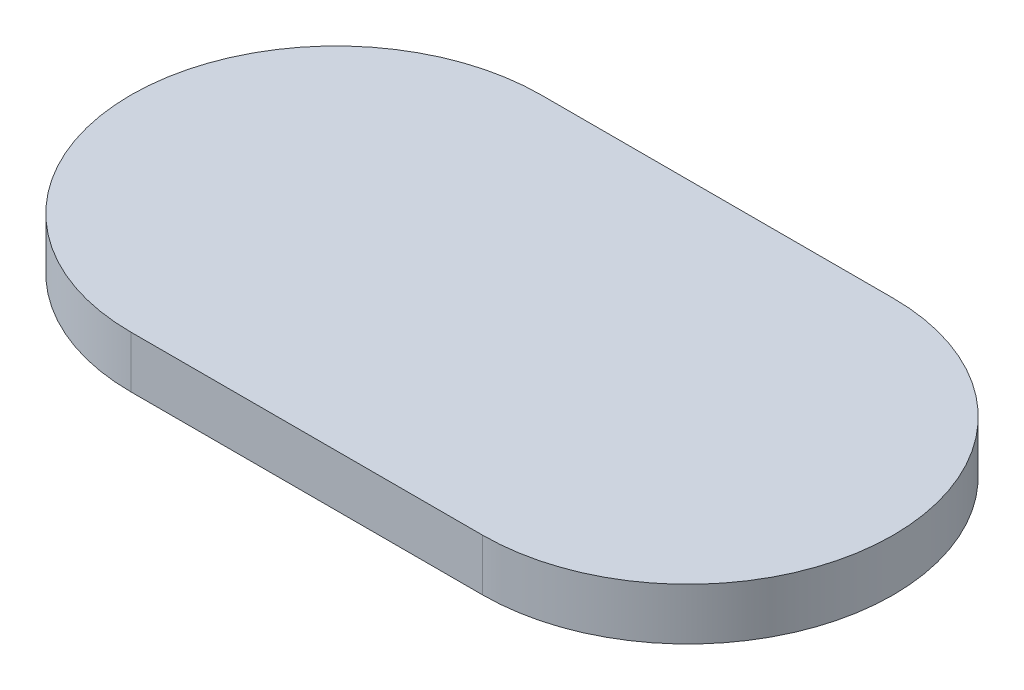
ISO-10303-21;
HEADER;
FILE_DESCRIPTION(('STEP AP214'),'2;1');
FILE_NAME('part.step','',(''),(''),'','','');
FILE_SCHEMA(('AUTOMOTIVE_DESIGN { 1 0 10303 214 1 1 1 1 }'));
ENDSEC;
DATA;
#1=APPLICATION_CONTEXT('core data for automotive mechanical design processes');
#2=APPLICATION_PROTOCOL_DEFINITION('international standard','automotive_design',2000,#1);
#3=PRODUCT_CONTEXT('',#1,'mechanical');
#4=PRODUCT('Part','Part','',(#3));
#5=PRODUCT_RELATED_PRODUCT_CATEGORY('part','',(#4));
#6=PRODUCT_DEFINITION_FORMATION('','',#4);
#7=PRODUCT_DEFINITION_CONTEXT('part definition',#1,'design');
#8=PRODUCT_DEFINITION('design','',#6,#7);
#9=PRODUCT_DEFINITION_SHAPE('','',#8);
#10=(LENGTH_UNIT() NAMED_UNIT(*) SI_UNIT(.MILLI.,.METRE.));
#11=(NAMED_UNIT(*) PLANE_ANGLE_UNIT() SI_UNIT($,.RADIAN.));
#12=(NAMED_UNIT(*) SI_UNIT($,.STERADIAN.) SOLID_ANGLE_UNIT());
#13=UNCERTAINTY_MEASURE_WITH_UNIT(LENGTH_MEASURE(1.E-05),#10,'distance_accuracy_value','');
#14=(GEOMETRIC_REPRESENTATION_CONTEXT(3) GLOBAL_UNCERTAINTY_ASSIGNED_CONTEXT((#13)) GLOBAL_UNIT_ASSIGNED_CONTEXT((#10,
#11,#12)) REPRESENTATION_CONTEXT('',''));
#15=CARTESIAN_POINT('',(0.,0.,0.));
#16=DIRECTION('',(0.,0.,1.));
#17=DIRECTION('',(1.,0.,0.));
#18=AXIS2_PLACEMENT_3D('',#15,#16,#17);
#19=CARTESIAN_POINT('',(10.2,3.,0.));
#20=DIRECTION('',(0.,-1.,0.));
#21=DIRECTION('',(0.,0.,-1.));
#22=AXIS2_PLACEMENT_3D('',#19,#20,#21);
#23=CYLINDRICAL_SURFACE('',#22,11.9);
#24=CARTESIAN_POINT('',(10.2,0.,0.));
#25=DIRECTION('',(0.,1.,0.));
#26=DIRECTION('',(0.,0.,1.));
#27=AXIS2_PLACEMENT_3D('',#24,#25,#26);
#28=CIRCLE('',#27,11.9);
#29=CARTESIAN_POINT('',(10.2,0.,11.9));
#30=VERTEX_POINT('',#29);
#31=CARTESIAN_POINT('',(10.2,0.,-11.9));
#32=VERTEX_POINT('',#31);
#33=EDGE_CURVE('E102',#30,#32,#28,.T.);
#34=ORIENTED_EDGE('',*,*,#33,.T.);
#35=DIRECTION('',(0.,-1.,0.));
#36=VECTOR('',#35,1.);
#37=CARTESIAN_POINT('',(10.2,3.,-11.9));
#38=LINE('',#37,#36);
#39=CARTESIAN_POINT('',(10.2,3.,-11.9));
#40=VERTEX_POINT('',#39);
#41=EDGE_CURVE('E93',#40,#32,#38,.T.);
#42=ORIENTED_EDGE('',*,*,#41,.F.);
#43=CARTESIAN_POINT('',(10.2,3.,0.));
#44=DIRECTION('',(0.,1.,0.));
#45=DIRECTION('',(0.,0.,1.));
#46=AXIS2_PLACEMENT_3D('',#43,#44,#45);
#47=CIRCLE('',#46,11.9);
#48=CARTESIAN_POINT('',(10.2,3.,11.9));
#49=VERTEX_POINT('',#48);
#50=EDGE_CURVE('E87',#49,#40,#47,.T.);
#51=ORIENTED_EDGE('',*,*,#50,.F.);
#52=DIRECTION('',(0.,-1.,0.));
#53=VECTOR('',#52,1.);
#54=CARTESIAN_POINT('',(10.2,3.,11.9));
#55=LINE('',#54,#53);
#56=EDGE_CURVE('E98',#49,#30,#55,.T.);
#57=ORIENTED_EDGE('',*,*,#56,.T.);
#58=EDGE_LOOP('',(#34,#42,#51,#57));
#59=FACE_BOUND('',#58,.T.);
#60=ADVANCED_FACE('F33',(#59),#23,.T.);
#61=CARTESIAN_POINT('',(10.2,3.,-11.9));
#62=DIRECTION('',(0.,0.,1.));
#63=DIRECTION('',(1.,0.,0.));
#64=AXIS2_PLACEMENT_3D('',#61,#62,#63);
#65=PLANE('',#64);
#66=DIRECTION('',(-1.,0.,0.));
#67=VECTOR('',#66,1.);
#68=CARTESIAN_POINT('',(10.2,0.,-11.9));
#69=LINE('',#68,#67);
#70=CARTESIAN_POINT('',(-10.2,0.,-11.9));
#71=VERTEX_POINT('',#70);
#72=EDGE_CURVE('E92',#32,#71,#69,.T.);
#73=ORIENTED_EDGE('',*,*,#72,.T.);
#74=DIRECTION('',(0.,-1.,0.));
#75=VECTOR('',#74,1.);
#76=CARTESIAN_POINT('',(-10.2,3.,-11.9));
#77=LINE('',#76,#75);
#78=CARTESIAN_POINT('',(-10.2,3.,-11.9));
#79=VERTEX_POINT('',#78);
#80=EDGE_CURVE('E90',#79,#71,#77,.T.);
#81=ORIENTED_EDGE('',*,*,#80,.F.);
#82=DIRECTION('',(-1.,0.,0.));
#83=VECTOR('',#82,1.);
#84=CARTESIAN_POINT('',(10.2,3.,-11.9));
#85=LINE('',#84,#83);
#86=EDGE_CURVE('E82',#40,#79,#85,.T.);
#87=ORIENTED_EDGE('',*,*,#86,.F.);
#88=ORIENTED_EDGE('',*,*,#41,.T.);
#89=EDGE_LOOP('',(#73,#81,#87,#88));
#90=FACE_BOUND('',#89,.T.);
#91=ADVANCED_FACE('F91',(#90),#65,.F.);
#92=CARTESIAN_POINT('',(-10.2,3.,0.));
#93=DIRECTION('',(0.,-1.,0.));
#94=DIRECTION('',(0.,0.,-1.));
#95=AXIS2_PLACEMENT_3D('',#92,#93,#94);
#96=CYLINDRICAL_SURFACE('',#95,11.9);
#97=CARTESIAN_POINT('',(-10.2,0.,0.));
#98=DIRECTION('',(0.,1.,0.));
#99=DIRECTION('',(0.,0.,1.));
#100=AXIS2_PLACEMENT_3D('',#97,#98,#99);
#101=CIRCLE('',#100,11.9);
#102=CARTESIAN_POINT('',(-10.2,0.,11.9));
#103=VERTEX_POINT('',#102);
#104=EDGE_CURVE('E68',#71,#103,#101,.T.);
#105=ORIENTED_EDGE('',*,*,#104,.T.);
#106=DIRECTION('',(0.,-1.,0.));
#107=VECTOR('',#106,1.);
#108=CARTESIAN_POINT('',(-10.2,3.,11.9));
#109=LINE('',#108,#107);
#110=CARTESIAN_POINT('',(-10.2,3.,11.9));
#111=VERTEX_POINT('',#110);
#112=EDGE_CURVE('E94',#111,#103,#109,.T.);
#113=ORIENTED_EDGE('',*,*,#112,.F.);
#114=CARTESIAN_POINT('',(-10.2,3.,0.));
#115=DIRECTION('',(0.,1.,0.));
#116=DIRECTION('',(0.,0.,1.));
#117=AXIS2_PLACEMENT_3D('',#114,#115,#116);
#118=CIRCLE('',#117,11.9);
#119=EDGE_CURVE('E85',#79,#111,#118,.T.);
#120=ORIENTED_EDGE('',*,*,#119,.F.);
#121=ORIENTED_EDGE('',*,*,#80,.T.);
#122=EDGE_LOOP('',(#105,#113,#120,#121));
#123=FACE_BOUND('',#122,.T.);
#124=ADVANCED_FACE('F96',(#123),#96,.T.);
#125=CARTESIAN_POINT('',(10.2,3.,11.9));
#126=DIRECTION('',(0.,0.,-1.));
#127=DIRECTION('',(-1.,0.,0.));
#128=AXIS2_PLACEMENT_3D('',#125,#126,#127);
#129=PLANE('',#128);
#130=DIRECTION('',(1.,0.,0.));
#131=VECTOR('',#130,1.);
#132=CARTESIAN_POINT('',(10.2,0.,11.9));
#133=LINE('',#132,#131);
#134=EDGE_CURVE('E74',#103,#30,#133,.T.);
#135=ORIENTED_EDGE('',*,*,#134,.T.);
#136=ORIENTED_EDGE('',*,*,#56,.F.);
#137=DIRECTION('',(1.,0.,0.));
#138=VECTOR('',#137,1.);
#139=CARTESIAN_POINT('',(10.2,3.,11.9));
#140=LINE('',#139,#138);
#141=EDGE_CURVE('E51',#111,#49,#140,.T.);
#142=ORIENTED_EDGE('',*,*,#141,.F.);
#143=ORIENTED_EDGE('',*,*,#112,.T.);
#144=EDGE_LOOP('',(#135,#136,#142,#143));
#145=FACE_BOUND('',#144,.T.);
#146=ADVANCED_FACE('F155',(#145),#129,.F.);
#147=CARTESIAN_POINT('',(10.2,3.,0.));
#148=DIRECTION('',(0.,1.,0.));
#149=DIRECTION('',(0.,0.,1.));
#150=AXIS2_PLACEMENT_3D('',#147,#148,#149);
#151=PLANE('',#150);
#152=ORIENTED_EDGE('',*,*,#50,.T.);
#153=ORIENTED_EDGE('',*,*,#86,.T.);
#154=ORIENTED_EDGE('',*,*,#119,.T.);
#155=ORIENTED_EDGE('',*,*,#141,.T.);
#156=EDGE_LOOP('',(#152,#153,#154,#155));
#157=FACE_BOUND('',#156,.T.);
#158=ADVANCED_FACE('F83',(#157),#151,.T.);
#159=CARTESIAN_POINT('',(10.2,0.,0.));
#160=DIRECTION('',(0.,1.,0.));
#161=DIRECTION('',(0.,0.,1.));
#162=AXIS2_PLACEMENT_3D('',#159,#160,#161);
#163=PLANE('',#162);
#164=CARTESIAN_POINT('',(10.2,0.,0.));
#165=DIRECTION('',(0.,1.,0.));
#166=DIRECTION('',(0.,0.,1.));
#167=AXIS2_PLACEMENT_3D('',#164,#165,#166);
#168=CIRCLE('',#167,1.75);
#169=CARTESIAN_POINT('',(10.2,0.,1.75));
#170=VERTEX_POINT('',#169);
#171=EDGE_CURVE('E36',#170,#170,#168,.F.);
#172=ORIENTED_EDGE('',*,*,#171,.F.);
#173=EDGE_LOOP('',(#172));
#174=FACE_BOUND('',#173,.T.);
#175=CARTESIAN_POINT('',(-10.2,0.,0.));
#176=DIRECTION('',(0.,1.,0.));
#177=DIRECTION('',(0.,0.,1.));
#178=AXIS2_PLACEMENT_3D('',#175,#176,#177);
#179=CIRCLE('',#178,3.25);
#180=CARTESIAN_POINT('',(-10.2,0.,3.25));
#181=VERTEX_POINT('',#180);
#182=EDGE_CURVE('E111',#181,#181,#179,.F.);
#183=ORIENTED_EDGE('',*,*,#182,.F.);
#184=EDGE_LOOP('',(#183));
#185=FACE_BOUND('',#184,.T.);
#186=ORIENTED_EDGE('',*,*,#33,.F.);
#187=ORIENTED_EDGE('',*,*,#134,.F.);
#188=ORIENTED_EDGE('',*,*,#104,.F.);
#189=ORIENTED_EDGE('',*,*,#72,.F.);
#190=EDGE_LOOP('',(#186,#187,#188,#189));
#191=FACE_BOUND('',#190,.T.);
#192=ADVANCED_FACE('F136',(#174,#185,#191),#163,.F.);
#193=CARTESIAN_POINT('',(-10.2,-5.,0.));
#194=DIRECTION('',(0.,1.,0.));
#195=DIRECTION('',(0.,0.,1.));
#196=AXIS2_PLACEMENT_3D('',#193,#194,#195);
#197=CYLINDRICAL_SURFACE('',#196,3.25);
#198=CARTESIAN_POINT('',(-10.2,-5.,0.));
#199=DIRECTION('',(0.,-1.,0.));
#200=DIRECTION('',(0.,0.,-1.));
#201=AXIS2_PLACEMENT_3D('',#198,#199,#200);
#202=CIRCLE('',#201,3.25);
#203=CARTESIAN_POINT('',(-10.2,-5.,-3.25));
#204=VERTEX_POINT('',#203);
#205=EDGE_CURVE('E105',#204,#204,#202,.T.);
#206=ORIENTED_EDGE('',*,*,#205,.F.);
#207=EDGE_LOOP('',(#206));
#208=FACE_BOUND('',#207,.T.);
#209=ORIENTED_EDGE('',*,*,#182,.T.);
#210=EDGE_LOOP('',(#209));
#211=FACE_BOUND('',#210,.T.);
#212=ADVANCED_FACE('F134',(#208,#211),#197,.T.);
#213=CARTESIAN_POINT('',(-10.2,-5.,0.));
#214=DIRECTION('',(0.,-1.,0.));
#215=DIRECTION('',(0.,0.,-1.));
#216=AXIS2_PLACEMENT_3D('',#213,#214,#215);
#217=PLANE('',#216);
#218=CARTESIAN_POINT('',(-10.2,-5.,0.));
#219=DIRECTION('',(0.,-1.,0.));
#220=DIRECTION('',(0.,0.,-1.));
#221=AXIS2_PLACEMENT_3D('',#218,#219,#220);
#222=CIRCLE('',#221,2.5);
#223=CARTESIAN_POINT('',(-10.2,-5.,-2.5));
#224=VERTEX_POINT('',#223);
#225=EDGE_CURVE('E42',#224,#224,#222,.T.);
#226=ORIENTED_EDGE('',*,*,#225,.F.);
#227=EDGE_LOOP('',(#226));
#228=FACE_BOUND('',#227,.T.);
#229=ORIENTED_EDGE('',*,*,#205,.T.);
#230=EDGE_LOOP('',(#229));
#231=FACE_BOUND('',#230,.T.);
#232=ADVANCED_FACE('F132',(#228,#231),#217,.T.);
#233=CARTESIAN_POINT('',(10.2,-5.,0.));
#234=DIRECTION('',(0.,1.,0.));
#235=DIRECTION('',(0.,0.,1.));
#236=AXIS2_PLACEMENT_3D('',#233,#234,#235);
#237=CYLINDRICAL_SURFACE('',#236,1.75);
#238=CARTESIAN_POINT('',(10.2,-5.,0.));
#239=DIRECTION('',(0.,-1.,0.));
#240=DIRECTION('',(0.,0.,-1.));
#241=AXIS2_PLACEMENT_3D('',#238,#239,#240);
#242=CIRCLE('',#241,1.75);
#243=CARTESIAN_POINT('',(10.2,-5.,-1.75));
#244=VERTEX_POINT('',#243);
#245=EDGE_CURVE('E126',#244,#244,#242,.T.);
#246=ORIENTED_EDGE('',*,*,#245,.F.);
#247=EDGE_LOOP('',(#246));
#248=FACE_BOUND('',#247,.T.);
#249=ORIENTED_EDGE('',*,*,#171,.T.);
#250=EDGE_LOOP('',(#249));
#251=FACE_BOUND('',#250,.T.);
#252=ADVANCED_FACE('F142',(#248,#251),#237,.T.);
#253=CARTESIAN_POINT('',(10.2,-5.,0.));
#254=DIRECTION('',(0.,-1.,0.));
#255=DIRECTION('',(0.,0.,-1.));
#256=AXIS2_PLACEMENT_3D('',#253,#254,#255);
#257=PLANE('',#256);
#258=CARTESIAN_POINT('',(10.2,-5.,0.));
#259=DIRECTION('',(0.,-1.,0.));
#260=DIRECTION('',(0.,0.,-1.));
#261=AXIS2_PLACEMENT_3D('',#258,#259,#260);
#262=CIRCLE('',#261,1.);
#263=CARTESIAN_POINT('',(10.2,-5.,-1.));
#264=VERTEX_POINT('',#263);
#265=EDGE_CURVE('E11',#264,#264,#262,.T.);
#266=ORIENTED_EDGE('',*,*,#265,.F.);
#267=EDGE_LOOP('',(#266));
#268=FACE_BOUND('',#267,.T.);
#269=ORIENTED_EDGE('',*,*,#245,.T.);
#270=EDGE_LOOP('',(#269));
#271=FACE_BOUND('',#270,.T.);
#272=ADVANCED_FACE('F209',(#268,#271),#257,.T.);
#273=CARTESIAN_POINT('',(-10.2,-7.5,0.));
#274=DIRECTION('',(0.,1.,0.));
#275=DIRECTION('',(0.,0.,1.));
#276=AXIS2_PLACEMENT_3D('',#273,#274,#275);
#277=CYLINDRICAL_SURFACE('',#276,2.5);
#278=CARTESIAN_POINT('',(-10.2,-7.5,0.));
#279=DIRECTION('',(0.,-1.,0.));
#280=DIRECTION('',(0.,0.,-1.));
#281=AXIS2_PLACEMENT_3D('',#278,#279,#280);
#282=CIRCLE('',#281,2.5);
#283=CARTESIAN_POINT('',(-10.2,-7.5,-2.5));
#284=VERTEX_POINT('',#283);
#285=EDGE_CURVE('E124',#284,#284,#282,.T.);
#286=ORIENTED_EDGE('',*,*,#285,.F.);
#287=EDGE_LOOP('',(#286));
#288=FACE_BOUND('',#287,.T.);
#289=ORIENTED_EDGE('',*,*,#225,.T.);
#290=EDGE_LOOP('',(#289));
#291=FACE_BOUND('',#290,.T.);
#292=ADVANCED_FACE('F217',(#288,#291),#277,.T.);
#293=CARTESIAN_POINT('',(-10.2,-7.5,0.));
#294=DIRECTION('',(0.,-1.,0.));
#295=DIRECTION('',(0.,0.,-1.));
#296=AXIS2_PLACEMENT_3D('',#293,#294,#295);
#297=PLANE('',#296);
#298=ORIENTED_EDGE('',*,*,#285,.T.);
#299=EDGE_LOOP('',(#298));
#300=FACE_BOUND('',#299,.T.);
#301=ADVANCED_FACE('F226',(#300),#297,.T.);
#302=CARTESIAN_POINT('',(10.2,-7.5,0.));
#303=DIRECTION('',(0.,1.,0.));
#304=DIRECTION('',(0.,0.,1.));
#305=AXIS2_PLACEMENT_3D('',#302,#303,#304);
#306=CYLINDRICAL_SURFACE('',#305,1.);
#307=CARTESIAN_POINT('',(10.2,-7.5,0.));
#308=DIRECTION('',(0.,-1.,0.));
#309=DIRECTION('',(0.,0.,-1.));
#310=AXIS2_PLACEMENT_3D('',#307,#308,#309);
#311=CIRCLE('',#310,1.);
#312=CARTESIAN_POINT('',(10.2,-7.5,-1.));
#313=VERTEX_POINT('',#312);
#314=EDGE_CURVE('E264',#313,#313,#311,.T.);
#315=ORIENTED_EDGE('',*,*,#314,.F.);
#316=EDGE_LOOP('',(#315));
#317=FACE_BOUND('',#316,.T.);
#318=ORIENTED_EDGE('',*,*,#265,.T.);
#319=EDGE_LOOP('',(#318));
#320=FACE_BOUND('',#319,.T.);
#321=ADVANCED_FACE('F235',(#317,#320),#306,.T.);
#322=CARTESIAN_POINT('',(10.2,-7.5,0.));
#323=DIRECTION('',(0.,-1.,0.));
#324=DIRECTION('',(0.,0.,-1.));
#325=AXIS2_PLACEMENT_3D('',#322,#323,#324);
#326=PLANE('',#325);
#327=ORIENTED_EDGE('',*,*,#314,.T.);
#328=EDGE_LOOP('',(#327));
#329=FACE_BOUND('',#328,.T.);
#330=ADVANCED_FACE('F244',(#329),#326,.T.);
#331=CLOSED_SHELL('',(#60,#91,#124,#146,#158,#192,#212,#232,#252,#272,#292,#301,#321,#330));
#332=MANIFOLD_SOLID_BREP('B2',#331);
#333=ADVANCED_BREP_SHAPE_REPRESENTATION('',(#18,#332),#14);
#334=SHAPE_DEFINITION_REPRESENTATION(#9,#333);
ENDSEC;
END-ISO-10303-21;
